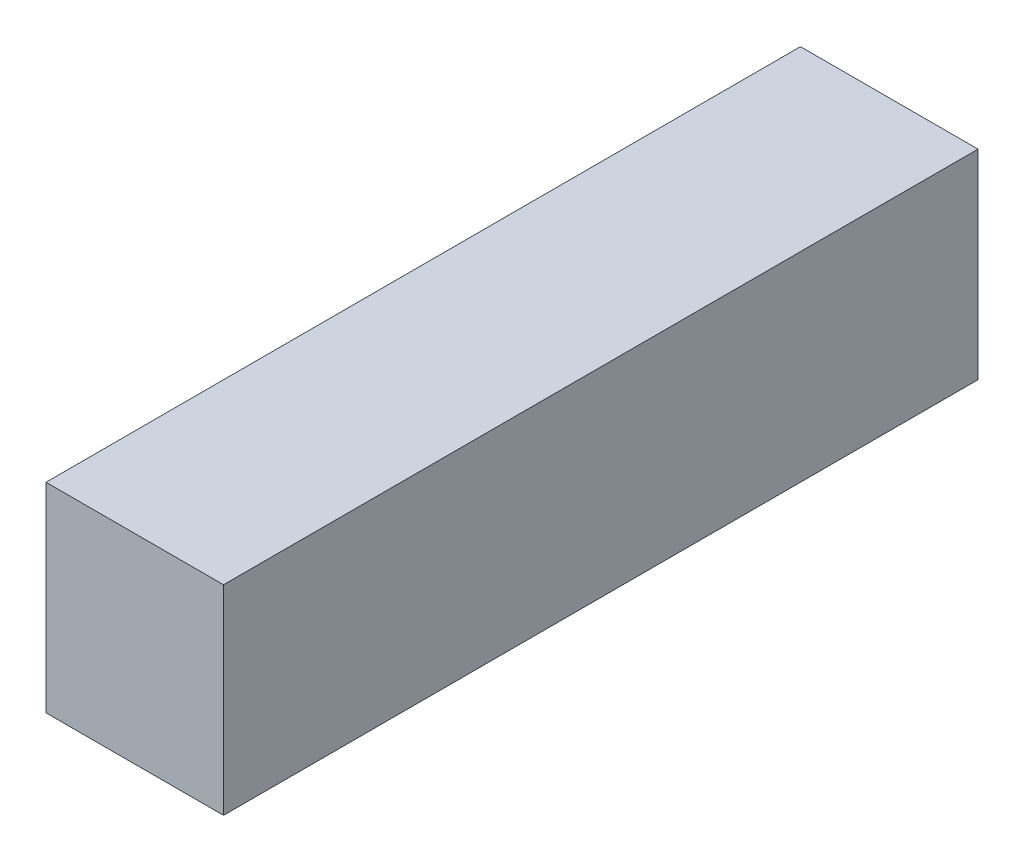
ISO-10303-21;
HEADER;
FILE_DESCRIPTION(('STEP AP214'),'2;1');
FILE_NAME('part.step','',(''),(''),'','','');
FILE_SCHEMA(('AUTOMOTIVE_DESIGN { 1 0 10303 214 1 1 1 1 }'));
ENDSEC;
DATA;
#1=APPLICATION_CONTEXT('core data for automotive mechanical design processes');
#2=APPLICATION_PROTOCOL_DEFINITION('international standard','automotive_design',2000,#1);
#3=PRODUCT_CONTEXT('',#1,'mechanical');
#4=PRODUCT('Part','Part','',(#3));
#5=PRODUCT_RELATED_PRODUCT_CATEGORY('part','',(#4));
#6=PRODUCT_DEFINITION_FORMATION('','',#4);
#7=PRODUCT_DEFINITION_CONTEXT('part definition',#1,'design');
#8=PRODUCT_DEFINITION('design','',#6,#7);
#9=PRODUCT_DEFINITION_SHAPE('','',#8);
#10=(LENGTH_UNIT() NAMED_UNIT(*) SI_UNIT(.MILLI.,.METRE.));
#11=(NAMED_UNIT(*) PLANE_ANGLE_UNIT() SI_UNIT($,.RADIAN.));
#12=(NAMED_UNIT(*) SI_UNIT($,.STERADIAN.) SOLID_ANGLE_UNIT());
#13=UNCERTAINTY_MEASURE_WITH_UNIT(LENGTH_MEASURE(1.E-05),#10,'distance_accuracy_value','');
#14=(GEOMETRIC_REPRESENTATION_CONTEXT(3) GLOBAL_UNCERTAINTY_ASSIGNED_CONTEXT((#13)) GLOBAL_UNIT_ASSIGNED_CONTEXT((#10,
#11,#12)) REPRESENTATION_CONTEXT('',''));
#15=CARTESIAN_POINT('',(0.,0.,0.));
#16=DIRECTION('',(0.,0.,1.));
#17=DIRECTION('',(1.,0.,0.));
#18=AXIS2_PLACEMENT_3D('',#15,#16,#17);
#19=CARTESIAN_POINT('',(-4.,9.,-17.));
#20=DIRECTION('',(1.,0.,0.));
#21=DIRECTION('',(0.,0.,-1.));
#22=AXIS2_PLACEMENT_3D('',#19,#20,#21);
#23=PLANE('',#22);
#24=DIRECTION('',(0.,0.,1.));
#25=VECTOR('',#24,1.);
#26=CARTESIAN_POINT('',(-4.,0.,-17.));
#27=LINE('',#26,#25);
#28=CARTESIAN_POINT('',(-4.,0.,-17.));
#29=VERTEX_POINT('',#28);
#30=CARTESIAN_POINT('',(-4.,0.,17.));
#31=VERTEX_POINT('',#30);
#32=EDGE_CURVE('E107',#29,#31,#27,.T.);
#33=ORIENTED_EDGE('',*,*,#32,.T.);
#34=DIRECTION('',(0.,-1.,0.));
#35=VECTOR('',#34,1.);
#36=CARTESIAN_POINT('',(-4.,9.,17.));
#37=LINE('',#36,#35);
#38=CARTESIAN_POINT('',(-4.,9.,17.));
#39=VERTEX_POINT('',#38);
#40=EDGE_CURVE('E11',#39,#31,#37,.T.);
#41=ORIENTED_EDGE('',*,*,#40,.F.);
#42=DIRECTION('',(0.,0.,1.));
#43=VECTOR('',#42,1.);
#44=CARTESIAN_POINT('',(-4.,9.,-17.));
#45=LINE('',#44,#43);
#46=CARTESIAN_POINT('',(-4.,9.,-17.));
#47=VERTEX_POINT('',#46);
#48=EDGE_CURVE('E92',#47,#39,#45,.T.);
#49=ORIENTED_EDGE('',*,*,#48,.F.);
#50=DIRECTION('',(0.,-1.,0.));
#51=VECTOR('',#50,1.);
#52=CARTESIAN_POINT('',(-4.,9.,-17.));
#53=LINE('',#52,#51);
#54=EDGE_CURVE('E105',#47,#29,#53,.T.);
#55=ORIENTED_EDGE('',*,*,#54,.T.);
#56=EDGE_LOOP('',(#33,#41,#49,#55));
#57=FACE_BOUND('',#56,.T.);
#58=ADVANCED_FACE('F43',(#57),#23,.F.);
#59=CARTESIAN_POINT('',(-4.,9.,17.));
#60=DIRECTION('',(0.,0.,-1.));
#61=DIRECTION('',(-1.,0.,0.));
#62=AXIS2_PLACEMENT_3D('',#59,#60,#61);
#63=PLANE('',#62);
#64=DIRECTION('',(1.,0.,0.));
#65=VECTOR('',#64,1.);
#66=CARTESIAN_POINT('',(-4.,0.,17.));
#67=LINE('',#66,#65);
#68=CARTESIAN_POINT('',(4.,0.,17.));
#69=VERTEX_POINT('',#68);
#70=EDGE_CURVE('E97',#31,#69,#67,.T.);
#71=ORIENTED_EDGE('',*,*,#70,.T.);
#72=DIRECTION('',(0.,-1.,0.));
#73=VECTOR('',#72,1.);
#74=CARTESIAN_POINT('',(4.,9.,17.));
#75=LINE('',#74,#73);
#76=CARTESIAN_POINT('',(4.,9.,17.));
#77=VERTEX_POINT('',#76);
#78=EDGE_CURVE('E51',#77,#69,#75,.T.);
#79=ORIENTED_EDGE('',*,*,#78,.F.);
#80=DIRECTION('',(1.,0.,0.));
#81=VECTOR('',#80,1.);
#82=CARTESIAN_POINT('',(-4.,9.,17.));
#83=LINE('',#82,#81);
#84=EDGE_CURVE('E87',#39,#77,#83,.T.);
#85=ORIENTED_EDGE('',*,*,#84,.F.);
#86=ORIENTED_EDGE('',*,*,#40,.T.);
#87=EDGE_LOOP('',(#71,#79,#85,#86));
#88=FACE_BOUND('',#87,.T.);
#89=ADVANCED_FACE('F100',(#88),#63,.F.);
#90=CARTESIAN_POINT('',(4.,9.,17.));
#91=DIRECTION('',(-1.,0.,0.));
#92=DIRECTION('',(0.,0.,1.));
#93=AXIS2_PLACEMENT_3D('',#90,#91,#92);
#94=PLANE('',#93);
#95=DIRECTION('',(0.,0.,-1.));
#96=VECTOR('',#95,1.);
#97=CARTESIAN_POINT('',(4.,0.,17.));
#98=LINE('',#97,#96);
#99=CARTESIAN_POINT('',(4.,0.,-17.));
#100=VERTEX_POINT('',#99);
#101=EDGE_CURVE('E78',#69,#100,#98,.T.);
#102=ORIENTED_EDGE('',*,*,#101,.T.);
#103=DIRECTION('',(0.,-1.,0.));
#104=VECTOR('',#103,1.);
#105=CARTESIAN_POINT('',(4.,9.,-17.));
#106=LINE('',#105,#104);
#107=CARTESIAN_POINT('',(4.,9.,-17.));
#108=VERTEX_POINT('',#107);
#109=EDGE_CURVE('E98',#108,#100,#106,.T.);
#110=ORIENTED_EDGE('',*,*,#109,.F.);
#111=DIRECTION('',(0.,0.,-1.));
#112=VECTOR('',#111,1.);
#113=CARTESIAN_POINT('',(4.,9.,17.));
#114=LINE('',#113,#112);
#115=EDGE_CURVE('E95',#77,#108,#114,.T.);
#116=ORIENTED_EDGE('',*,*,#115,.F.);
#117=ORIENTED_EDGE('',*,*,#78,.T.);
#118=EDGE_LOOP('',(#102,#110,#116,#117));
#119=FACE_BOUND('',#118,.T.);
#120=ADVANCED_FACE('F99',(#119),#94,.F.);
#121=CARTESIAN_POINT('',(4.,9.,-17.));
#122=DIRECTION('',(0.,0.,1.));
#123=DIRECTION('',(1.,0.,0.));
#124=AXIS2_PLACEMENT_3D('',#121,#122,#123);
#125=PLANE('',#124);
#126=DIRECTION('',(-1.,0.,0.));
#127=VECTOR('',#126,1.);
#128=CARTESIAN_POINT('',(4.,0.,-17.));
#129=LINE('',#128,#127);
#130=EDGE_CURVE('E85',#100,#29,#129,.T.);
#131=ORIENTED_EDGE('',*,*,#130,.T.);
#132=ORIENTED_EDGE('',*,*,#54,.F.);
#133=DIRECTION('',(-1.,0.,0.));
#134=VECTOR('',#133,1.);
#135=CARTESIAN_POINT('',(4.,9.,-17.));
#136=LINE('',#135,#134);
#137=EDGE_CURVE('E56',#108,#47,#136,.T.);
#138=ORIENTED_EDGE('',*,*,#137,.F.);
#139=ORIENTED_EDGE('',*,*,#109,.T.);
#140=EDGE_LOOP('',(#131,#132,#138,#139));
#141=FACE_BOUND('',#140,.T.);
#142=ADVANCED_FACE('F111',(#141),#125,.F.);
#143=CARTESIAN_POINT('',(0.,9.,0.));
#144=DIRECTION('',(0.,1.,0.));
#145=DIRECTION('',(0.,0.,1.));
#146=AXIS2_PLACEMENT_3D('',#143,#144,#145);
#147=PLANE('',#146);
#148=ORIENTED_EDGE('',*,*,#48,.T.);
#149=ORIENTED_EDGE('',*,*,#84,.T.);
#150=ORIENTED_EDGE('',*,*,#115,.T.);
#151=ORIENTED_EDGE('',*,*,#137,.T.);
#152=EDGE_LOOP('',(#148,#149,#150,#151));
#153=FACE_BOUND('',#152,.T.);
#154=ADVANCED_FACE('F89',(#153),#147,.T.);
#155=CARTESIAN_POINT('',(0.,0.,0.));
#156=DIRECTION('',(0.,1.,0.));
#157=DIRECTION('',(0.,0.,1.));
#158=AXIS2_PLACEMENT_3D('',#155,#156,#157);
#159=PLANE('',#158);
#160=ORIENTED_EDGE('',*,*,#32,.F.);
#161=ORIENTED_EDGE('',*,*,#130,.F.);
#162=ORIENTED_EDGE('',*,*,#101,.F.);
#163=ORIENTED_EDGE('',*,*,#70,.F.);
#164=EDGE_LOOP('',(#160,#161,#162,#163));
#165=FACE_BOUND('',#164,.T.);
#166=ADVANCED_FACE('F117',(#165),#159,.F.);
#167=CLOSED_SHELL('',(#58,#89,#120,#142,#154,#166));
#168=MANIFOLD_SOLID_BREP('B2',#167);
#169=ADVANCED_BREP_SHAPE_REPRESENTATION('',(#18,#168),#14);
#170=SHAPE_DEFINITION_REPRESENTATION(#9,#169);
ENDSEC;
END-ISO-10303-21;
